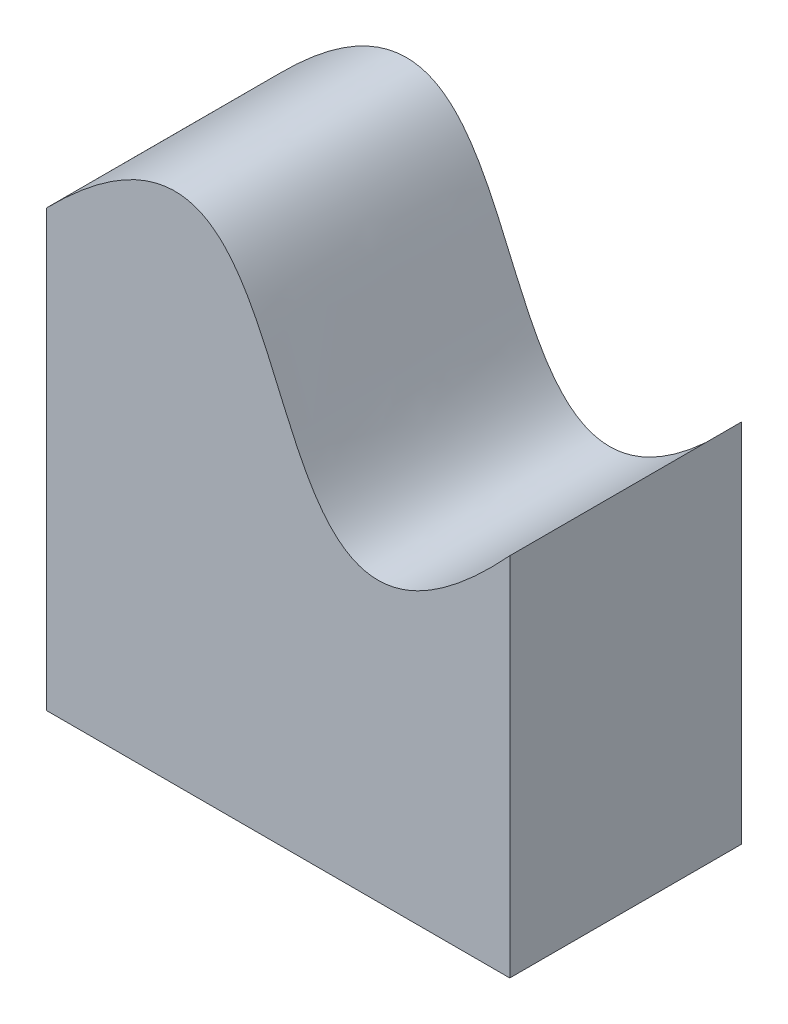
ISO-10303-21;
HEADER;
FILE_DESCRIPTION(('STEP AP214'),'2;1');
FILE_NAME('part.step','',(''),(''),'','','');
FILE_SCHEMA(('AUTOMOTIVE_DESIGN { 1 0 10303 214 1 1 1 1 }'));
ENDSEC;
DATA;
#1=APPLICATION_CONTEXT('core data for automotive mechanical design processes');
#2=APPLICATION_PROTOCOL_DEFINITION('international standard','automotive_design',2000,#1);
#3=PRODUCT_CONTEXT('',#1,'mechanical');
#4=PRODUCT('Part','Part','',(#3));
#5=PRODUCT_RELATED_PRODUCT_CATEGORY('part','',(#4));
#6=PRODUCT_DEFINITION_FORMATION('','',#4);
#7=PRODUCT_DEFINITION_CONTEXT('part definition',#1,'design');
#8=PRODUCT_DEFINITION('design','',#6,#7);
#9=PRODUCT_DEFINITION_SHAPE('','',#8);
#10=(LENGTH_UNIT() NAMED_UNIT(*) SI_UNIT(.MILLI.,.METRE.));
#11=(NAMED_UNIT(*) PLANE_ANGLE_UNIT() SI_UNIT($,.RADIAN.));
#12=(NAMED_UNIT(*) SI_UNIT($,.STERADIAN.) SOLID_ANGLE_UNIT());
#13=UNCERTAINTY_MEASURE_WITH_UNIT(LENGTH_MEASURE(1.E-05),#10,'distance_accuracy_value','');
#14=(GEOMETRIC_REPRESENTATION_CONTEXT(3) GLOBAL_UNCERTAINTY_ASSIGNED_CONTEXT((#13)) GLOBAL_UNIT_ASSIGNED_CONTEXT((#10,
#11,#12)) REPRESENTATION_CONTEXT('',''));
#15=CARTESIAN_POINT('',(0.,0.,0.));
#16=DIRECTION('',(0.,0.,1.));
#17=DIRECTION('',(1.,0.,0.));
#18=AXIS2_PLACEMENT_3D('',#15,#16,#17);
#19=CARTESIAN_POINT('',(0.,37.6158513088853,-0.00999999999999959));
#20=CARTESIAN_POINT('',(25.7925453870106,63.7832565901815,-0.00999999999999959));
#21=CARTESIAN_POINT('',(14.3856436401245,3.83829210486628,-0.00999999999999959));
#22=CARTESIAN_POINT('',(40.,31.5893405988277,-0.00999999999999959));
#23=B_SPLINE_CURVE_WITH_KNOTS('',3,(#19,#20,#21,#22),.UNSPECIFIED.,.F.,.F.,(4,4),(0.,1.),.UNSPECIFIED.);
#24=DIRECTION('',(0.,0.,1.));
#25=VECTOR('',#24,1.);
#26=SURFACE_OF_LINEAR_EXTRUSION('',#23,#25);
#27=DIRECTION('',(0.,0.,1.));
#28=VECTOR('',#27,1.);
#29=CARTESIAN_POINT('',(0.,37.6158513088853,-0.00999999999999959));
#30=LINE('',#29,#28);
#31=CARTESIAN_POINT('',(0.,37.6158513088853,0.));
#32=VERTEX_POINT('',#31);
#33=CARTESIAN_POINT('',(0.,37.6158513088853,20.));
#34=VERTEX_POINT('',#33);
#35=EDGE_CURVE('E46',#32,#34,#30,.T.);
#36=ORIENTED_EDGE('',*,*,#35,.T.);
#37=CARTESIAN_POINT('',(0.,37.6158513088853,20.));
#38=CARTESIAN_POINT('',(25.7925453870106,63.7832565901815,20.));
#39=CARTESIAN_POINT('',(14.3856436401245,3.83829210486628,20.));
#40=CARTESIAN_POINT('',(40.,31.5893405988277,20.));
#41=B_SPLINE_CURVE_WITH_KNOTS('',3,(#37,#38,#39,#40),.UNSPECIFIED.,.F.,.F.,(4,4),(0.,1.),.UNSPECIFIED.);
#42=CARTESIAN_POINT('',(40.,31.5893405988277,20.));
#43=VERTEX_POINT('',#42);
#44=EDGE_CURVE('E11',#34,#43,#41,.T.);
#45=ORIENTED_EDGE('',*,*,#44,.T.);
#46=DIRECTION('',(0.,0.,1.));
#47=VECTOR('',#46,1.);
#48=CARTESIAN_POINT('',(40.,31.5893405988277,-0.00999999999999959));
#49=LINE('',#48,#47);
#50=CARTESIAN_POINT('',(40.,31.5893405988277,0.));
#51=VERTEX_POINT('',#50);
#52=EDGE_CURVE('E60',#51,#43,#49,.T.);
#53=ORIENTED_EDGE('',*,*,#52,.F.);
#54=CARTESIAN_POINT('',(0.,37.6158513088853,0.));
#55=CARTESIAN_POINT('',(25.7925453870106,63.7832565901815,0.));
#56=CARTESIAN_POINT('',(14.3856436401245,3.83829210486628,0.));
#57=CARTESIAN_POINT('',(40.,31.5893405988277,0.));
#58=B_SPLINE_CURVE_WITH_KNOTS('',3,(#54,#55,#56,#57),.UNSPECIFIED.,.F.,.F.,(4,4),(0.,1.),.UNSPECIFIED.);
#59=EDGE_CURVE('E105',#32,#51,#58,.T.);
#60=ORIENTED_EDGE('',*,*,#59,.F.);
#61=EDGE_LOOP('',(#36,#45,#53,#60));
#62=FACE_BOUND('',#61,.T.);
#63=ADVANCED_FACE('F36',(#62),#26,.F.);
#64=CARTESIAN_POINT('',(0.,0.,20.));
#65=DIRECTION('',(0.,1.,0.));
#66=DIRECTION('',(0.,0.,1.));
#67=AXIS2_PLACEMENT_3D('',#64,#65,#66);
#68=PLANE('',#67);
#69=DIRECTION('',(1.,0.,0.));
#70=VECTOR('',#69,1.);
#71=CARTESIAN_POINT('',(0.,0.,0.));
#72=LINE('',#71,#70);
#73=CARTESIAN_POINT('',(0.,0.,0.));
#74=VERTEX_POINT('',#73);
#75=CARTESIAN_POINT('',(40.,0.,0.));
#76=VERTEX_POINT('',#75);
#77=EDGE_CURVE('E91',#74,#76,#72,.T.);
#78=ORIENTED_EDGE('',*,*,#77,.T.);
#79=DIRECTION('',(0.,0.,-1.));
#80=VECTOR('',#79,1.);
#81=CARTESIAN_POINT('',(40.,0.,20.));
#82=LINE('',#81,#80);
#83=CARTESIAN_POINT('',(40.,0.,20.));
#84=VERTEX_POINT('',#83);
#85=EDGE_CURVE('E88',#84,#76,#82,.T.);
#86=ORIENTED_EDGE('',*,*,#85,.F.);
#87=DIRECTION('',(1.,0.,0.));
#88=VECTOR('',#87,1.);
#89=CARTESIAN_POINT('',(0.,0.,20.));
#90=LINE('',#89,#88);
#91=CARTESIAN_POINT('',(0.,0.,20.));
#92=VERTEX_POINT('',#91);
#93=EDGE_CURVE('E79',#92,#84,#90,.T.);
#94=ORIENTED_EDGE('',*,*,#93,.F.);
#95=DIRECTION('',(0.,0.,-1.));
#96=VECTOR('',#95,1.);
#97=CARTESIAN_POINT('',(0.,0.,20.));
#98=LINE('',#97,#96);
#99=EDGE_CURVE('E93',#92,#74,#98,.T.);
#100=ORIENTED_EDGE('',*,*,#99,.T.);
#101=EDGE_LOOP('',(#78,#86,#94,#100));
#102=FACE_BOUND('',#101,.T.);
#103=ADVANCED_FACE('F89',(#102),#68,.F.);
#104=CARTESIAN_POINT('',(40.,0.,20.));
#105=DIRECTION('',(-1.,0.,0.));
#106=DIRECTION('',(0.,0.,1.));
#107=AXIS2_PLACEMENT_3D('',#104,#105,#106);
#108=PLANE('',#107);
#109=DIRECTION('',(0.,1.,0.));
#110=VECTOR('',#109,1.);
#111=CARTESIAN_POINT('',(40.,0.,0.));
#112=LINE('',#111,#110);
#113=EDGE_CURVE('E102',#76,#51,#112,.T.);
#114=ORIENTED_EDGE('',*,*,#113,.T.);
#115=ORIENTED_EDGE('',*,*,#52,.T.);
#116=DIRECTION('',(0.,1.,0.));
#117=VECTOR('',#116,1.);
#118=CARTESIAN_POINT('',(40.,0.,20.));
#119=LINE('',#118,#117);
#120=EDGE_CURVE('E82',#84,#43,#119,.T.);
#121=ORIENTED_EDGE('',*,*,#120,.F.);
#122=ORIENTED_EDGE('',*,*,#85,.T.);
#123=EDGE_LOOP('',(#114,#115,#121,#122));
#124=FACE_BOUND('',#123,.T.);
#125=ADVANCED_FACE('F95',(#124),#108,.F.);
#126=CARTESIAN_POINT('',(0.,0.,20.));
#127=DIRECTION('',(-1.,0.,0.));
#128=DIRECTION('',(0.,0.,1.));
#129=AXIS2_PLACEMENT_3D('',#126,#127,#128);
#130=PLANE('',#129);
#131=ORIENTED_EDGE('',*,*,#35,.F.);
#132=DIRECTION('',(0.,1.,0.));
#133=VECTOR('',#132,1.);
#134=CARTESIAN_POINT('',(0.,0.,0.));
#135=LINE('',#134,#133);
#136=EDGE_CURVE('E96',#74,#32,#135,.T.);
#137=ORIENTED_EDGE('',*,*,#136,.F.);
#138=ORIENTED_EDGE('',*,*,#99,.F.);
#139=DIRECTION('',(0.,1.,0.));
#140=VECTOR('',#139,1.);
#141=CARTESIAN_POINT('',(0.,0.,20.));
#142=LINE('',#141,#140);
#143=EDGE_CURVE('E84',#92,#34,#142,.T.);
#144=ORIENTED_EDGE('',*,*,#143,.T.);
#145=EDGE_LOOP('',(#131,#137,#138,#144));
#146=FACE_BOUND('',#145,.T.);
#147=ADVANCED_FACE('F122',(#146),#130,.T.);
#148=CARTESIAN_POINT('',(0.,0.,0.));
#149=DIRECTION('',(0.,0.,1.));
#150=DIRECTION('',(1.,0.,0.));
#151=AXIS2_PLACEMENT_3D('',#148,#149,#150);
#152=PLANE('',#151);
#153=ORIENTED_EDGE('',*,*,#136,.T.);
#154=ORIENTED_EDGE('',*,*,#59,.T.);
#155=ORIENTED_EDGE('',*,*,#113,.F.);
#156=ORIENTED_EDGE('',*,*,#77,.F.);
#157=EDGE_LOOP('',(#153,#154,#155,#156));
#158=FACE_BOUND('',#157,.T.);
#159=ADVANCED_FACE('F124',(#158),#152,.F.);
#160=CARTESIAN_POINT('',(0.,0.,20.));
#161=DIRECTION('',(0.,0.,1.));
#162=DIRECTION('',(1.,0.,0.));
#163=AXIS2_PLACEMENT_3D('',#160,#161,#162);
#164=PLANE('',#163);
#165=ORIENTED_EDGE('',*,*,#44,.F.);
#166=ORIENTED_EDGE('',*,*,#143,.F.);
#167=ORIENTED_EDGE('',*,*,#93,.T.);
#168=ORIENTED_EDGE('',*,*,#120,.T.);
#169=EDGE_LOOP('',(#165,#166,#167,#168));
#170=FACE_BOUND('',#169,.T.);
#171=ADVANCED_FACE('F81',(#170),#164,.T.);
#172=CLOSED_SHELL('',(#63,#103,#125,#147,#159,#171));
#173=MANIFOLD_SOLID_BREP('B2',#172);
#174=ADVANCED_BREP_SHAPE_REPRESENTATION('',(#18,#173),#14);
#175=SHAPE_DEFINITION_REPRESENTATION(#9,#174);
ENDSEC;
END-ISO-10303-21;
